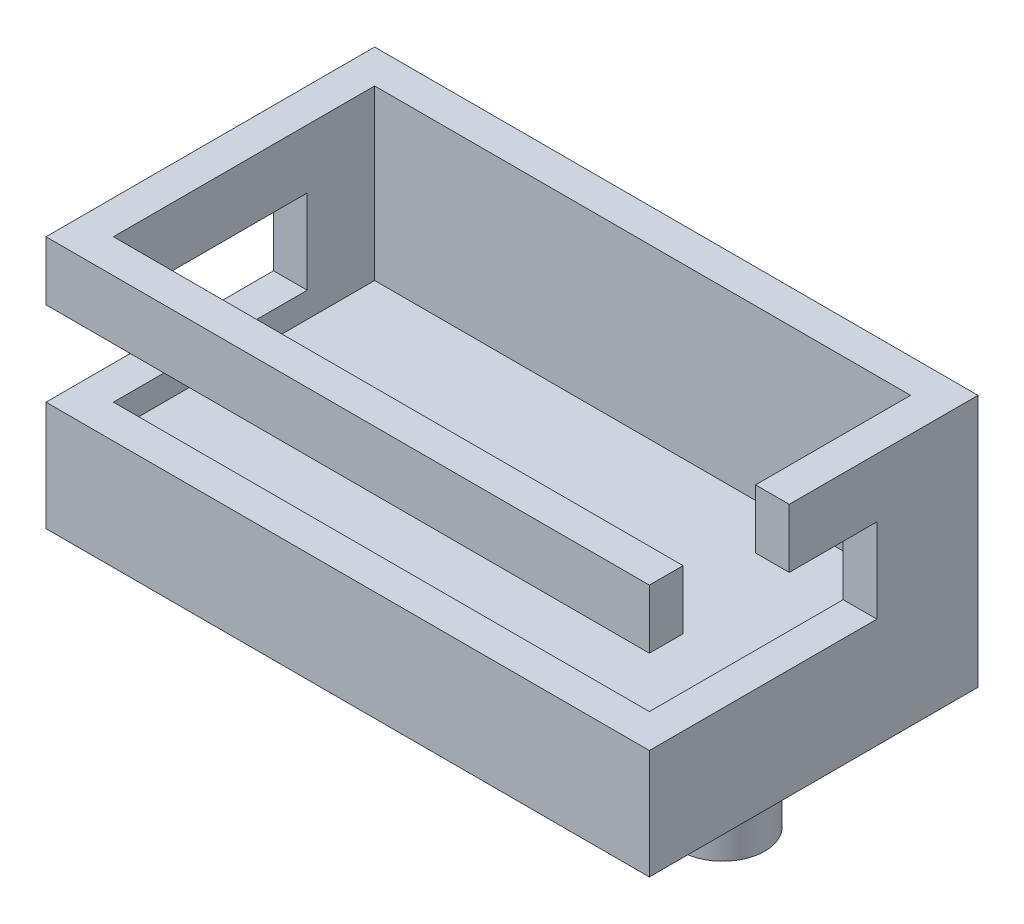
ISO-10303-21;
HEADER;
FILE_DESCRIPTION(('STEP AP214'),'2;1');
FILE_NAME('part.step','',(''),(''),'','','');
FILE_SCHEMA(('AUTOMOTIVE_DESIGN { 1 0 10303 214 1 1 1 1 }'));
ENDSEC;
DATA;
#1=APPLICATION_CONTEXT('core data for automotive mechanical design processes');
#2=APPLICATION_PROTOCOL_DEFINITION('international standard','automotive_design',2000,#1);
#3=PRODUCT_CONTEXT('',#1,'mechanical');
#4=PRODUCT('Part','Part','',(#3));
#5=PRODUCT_RELATED_PRODUCT_CATEGORY('part','',(#4));
#6=PRODUCT_DEFINITION_FORMATION('','',#4);
#7=PRODUCT_DEFINITION_CONTEXT('part definition',#1,'design');
#8=PRODUCT_DEFINITION('design','',#6,#7);
#9=PRODUCT_DEFINITION_SHAPE('','',#8);
#10=(LENGTH_UNIT() NAMED_UNIT(*) SI_UNIT(.MILLI.,.METRE.));
#11=(NAMED_UNIT(*) PLANE_ANGLE_UNIT() SI_UNIT($,.RADIAN.));
#12=(NAMED_UNIT(*) SI_UNIT($,.STERADIAN.) SOLID_ANGLE_UNIT());
#13=UNCERTAINTY_MEASURE_WITH_UNIT(LENGTH_MEASURE(1.E-05),#10,'distance_accuracy_value','');
#14=(GEOMETRIC_REPRESENTATION_CONTEXT(3) GLOBAL_UNCERTAINTY_ASSIGNED_CONTEXT((#13)) GLOBAL_UNIT_ASSIGNED_CONTEXT((#10,
#11,#12)) REPRESENTATION_CONTEXT('',''));
#15=CARTESIAN_POINT('',(0.,0.,0.));
#16=DIRECTION('',(0.,0.,1.));
#17=DIRECTION('',(1.,0.,0.));
#18=AXIS2_PLACEMENT_3D('',#15,#16,#17);
#19=CARTESIAN_POINT('',(33.8,10.,2.));
#20=DIRECTION('',(-1.,0.,0.));
#21=DIRECTION('',(0.,0.,1.));
#22=AXIS2_PLACEMENT_3D('',#19,#20,#21);
#23=PLANE('',#22);
#24=DIRECTION('',(0.,0.,-1.));
#25=VECTOR('',#24,1.);
#26=CARTESIAN_POINT('',(33.8,10.,2.));
#27=LINE('',#26,#25);
#28=CARTESIAN_POINT('',(33.8,10.,-6.30000000000001));
#29=VERTEX_POINT('',#28);
#30=CARTESIAN_POINT('',(33.8,10.,-17.5));
#31=VERTEX_POINT('',#30);
#32=EDGE_CURVE('E206',#29,#31,#27,.T.);
#33=ORIENTED_EDGE('',*,*,#32,.F.);
#34=DIRECTION('',(0.,1.,0.));
#35=VECTOR('',#34,1.);
#36=CARTESIAN_POINT('',(33.8,6.5,-6.30000000000001));
#37=LINE('',#36,#35);
#38=CARTESIAN_POINT('',(33.8,6.5,-6.30000000000001));
#39=VERTEX_POINT('',#38);
#40=EDGE_CURVE('E196',#39,#29,#37,.T.);
#41=ORIENTED_EDGE('',*,*,#40,.F.);
#42=DIRECTION('',(0.,0.,1.));
#43=VECTOR('',#42,1.);
#44=CARTESIAN_POINT('',(33.8,6.5,-53.6474757071638));
#45=LINE('',#44,#43);
#46=CARTESIAN_POINT('',(33.8,6.5,-11.5));
#47=VERTEX_POINT('',#46);
#48=EDGE_CURVE('E312',#47,#39,#45,.T.);
#49=ORIENTED_EDGE('',*,*,#48,.F.);
#50=DIRECTION('',(0.,-1.,0.));
#51=VECTOR('',#50,1.);
#52=CARTESIAN_POINT('',(33.8,6.5,-11.5));
#53=LINE('',#52,#51);
#54=CARTESIAN_POINT('',(33.8,1.5,-11.5));
#55=VERTEX_POINT('',#54);
#56=EDGE_CURVE('E288',#47,#55,#53,.T.);
#57=ORIENTED_EDGE('',*,*,#56,.T.);
#58=DIRECTION('',(0.,0.,1.));
#59=VECTOR('',#58,1.);
#60=CARTESIAN_POINT('',(33.8,1.5,-53.6474757071638));
#61=LINE('',#60,#59);
#62=CARTESIAN_POINT('',(33.8,1.5,2.));
#63=VERTEX_POINT('',#62);
#64=EDGE_CURVE('E316',#55,#63,#61,.T.);
#65=ORIENTED_EDGE('',*,*,#64,.T.);
#66=DIRECTION('',(0.,-1.,0.));
#67=VECTOR('',#66,1.);
#68=CARTESIAN_POINT('',(33.8,10.,2.));
#69=LINE('',#68,#67);
#70=CARTESIAN_POINT('',(33.8,-5.,2.));
#71=VERTEX_POINT('',#70);
#72=EDGE_CURVE('E228',#63,#71,#69,.T.);
#73=ORIENTED_EDGE('',*,*,#72,.T.);
#74=DIRECTION('',(0.,0.,-1.));
#75=VECTOR('',#74,1.);
#76=CARTESIAN_POINT('',(33.8,-5.,0.));
#77=LINE('',#76,#75);
#78=CARTESIAN_POINT('',(33.8,-5.,-17.5));
#79=VERTEX_POINT('',#78);
#80=EDGE_CURVE('E349',#71,#79,#77,.T.);
#81=ORIENTED_EDGE('',*,*,#80,.T.);
#82=DIRECTION('',(0.,-1.,0.));
#83=VECTOR('',#82,1.);
#84=CARTESIAN_POINT('',(33.8,10.,-17.5));
#85=LINE('',#84,#83);
#86=EDGE_CURVE('E225',#31,#79,#85,.T.);
#87=ORIENTED_EDGE('',*,*,#86,.F.);
#88=EDGE_LOOP('',(#33,#41,#49,#57,#65,#73,#81,#87));
#89=FACE_BOUND('',#88,.T.);
#90=ADVANCED_FACE('F49',(#89),#23,.F.);
#91=CARTESIAN_POINT('',(-2.,6.5,-53.6474757071638));
#92=DIRECTION('',(0.,1.,0.));
#93=DIRECTION('',(-1.,0.,0.));
#94=AXIS2_PLACEMENT_3D('',#91,#92,#93);
#95=PLANE('',#94);
#96=ORIENTED_EDGE('',*,*,#48,.T.);
#97=DIRECTION('',(1.,0.,0.));
#98=VECTOR('',#97,1.);
#99=CARTESIAN_POINT('',(24.5930589013091,6.5,-6.30000000000001));
#100=LINE('',#99,#98);
#101=CARTESIAN_POINT('',(31.8,6.5,-6.30000000000001));
#102=VERTEX_POINT('',#101);
#103=EDGE_CURVE('E278',#102,#39,#100,.T.);
#104=ORIENTED_EDGE('',*,*,#103,.F.);
#105=DIRECTION('',(0.,0.,-1.));
#106=VECTOR('',#105,1.);
#107=CARTESIAN_POINT('',(31.8,6.5,0.));
#108=LINE('',#107,#106);
#109=CARTESIAN_POINT('',(31.8,6.5,-11.5));
#110=VERTEX_POINT('',#109);
#111=EDGE_CURVE('E239',#102,#110,#108,.T.);
#112=ORIENTED_EDGE('',*,*,#111,.T.);
#113=DIRECTION('',(1.,0.,0.));
#114=VECTOR('',#113,1.);
#115=CARTESIAN_POINT('',(-2.,6.5,-11.5));
#116=LINE('',#115,#114);
#117=EDGE_CURVE('E292',#110,#47,#116,.T.);
#118=ORIENTED_EDGE('',*,*,#117,.T.);
#119=EDGE_LOOP('',(#96,#104,#112,#118));
#120=FACE_BOUND('',#119,.T.);
#121=ADVANCED_FACE('F420',(#120),#95,.F.);
#122=CARTESIAN_POINT('',(-2.,10.,2.));
#123=DIRECTION('',(0.,0.,-1.));
#124=DIRECTION('',(-1.,0.,0.));
#125=AXIS2_PLACEMENT_3D('',#122,#123,#124);
#126=PLANE('',#125);
#127=DIRECTION('',(0.,-1.,0.));
#128=VECTOR('',#127,1.);
#129=CARTESIAN_POINT('',(-2.,10.,2.));
#130=LINE('',#129,#128);
#131=CARTESIAN_POINT('',(-2.,10.,2.));
#132=VERTEX_POINT('',#131);
#133=CARTESIAN_POINT('',(-2.,6.5,2.));
#134=VERTEX_POINT('',#133);
#135=EDGE_CURVE('E218',#132,#134,#130,.T.);
#136=ORIENTED_EDGE('',*,*,#135,.T.);
#137=DIRECTION('',(-1.,0.,0.));
#138=VECTOR('',#137,1.);
#139=CARTESIAN_POINT('',(-2.,6.5,2.));
#140=LINE('',#139,#138);
#141=CARTESIAN_POINT('',(33.8,6.5,2.));
#142=VERTEX_POINT('',#141);
#143=EDGE_CURVE('E305',#142,#134,#140,.T.);
#144=ORIENTED_EDGE('',*,*,#143,.F.);
#145=CARTESIAN_POINT('',(33.8,10.,2.));
#146=VERTEX_POINT('',#145);
#147=EDGE_CURVE('E229',#146,#142,#69,.T.);
#148=ORIENTED_EDGE('',*,*,#147,.F.);
#149=DIRECTION('',(1.,0.,0.));
#150=VECTOR('',#149,1.);
#151=CARTESIAN_POINT('',(-2.,10.,2.));
#152=LINE('',#151,#150);
#153=EDGE_CURVE('E202',#132,#146,#152,.T.);
#154=ORIENTED_EDGE('',*,*,#153,.F.);
#155=EDGE_LOOP('',(#136,#144,#148,#154));
#156=FACE_BOUND('',#155,.T.);
#157=ADVANCED_FACE('F431',(#156),#126,.F.);
#158=CARTESIAN_POINT('',(0.,10.,0.));
#159=DIRECTION('',(0.,0.,-1.));
#160=DIRECTION('',(-1.,0.,0.));
#161=AXIS2_PLACEMENT_3D('',#158,#159,#160);
#162=PLANE('',#161);
#163=DIRECTION('',(1.,0.,0.));
#164=VECTOR('',#163,1.);
#165=CARTESIAN_POINT('',(0.,6.5,0.));
#166=LINE('',#165,#164);
#167=CARTESIAN_POINT('',(0.,6.5,0.));
#168=VERTEX_POINT('',#167);
#169=CARTESIAN_POINT('',(33.8,6.5,0.));
#170=VERTEX_POINT('',#169);
#171=EDGE_CURVE('E65',#168,#170,#166,.T.);
#172=ORIENTED_EDGE('',*,*,#171,.F.);
#173=DIRECTION('',(0.,-1.,0.));
#174=VECTOR('',#173,1.);
#175=CARTESIAN_POINT('',(0.,10.,0.));
#176=LINE('',#175,#174);
#177=CARTESIAN_POINT('',(0.,10.,0.));
#178=VERTEX_POINT('',#177);
#179=EDGE_CURVE('E181',#178,#168,#176,.T.);
#180=ORIENTED_EDGE('',*,*,#179,.F.);
#181=DIRECTION('',(1.,0.,0.));
#182=VECTOR('',#181,1.);
#183=CARTESIAN_POINT('',(0.,10.,0.));
#184=LINE('',#183,#182);
#185=CARTESIAN_POINT('',(33.8,10.,0.));
#186=VERTEX_POINT('',#185);
#187=EDGE_CURVE('E175',#178,#186,#184,.T.);
#188=ORIENTED_EDGE('',*,*,#187,.T.);
#189=DIRECTION('',(0.,-1.,0.));
#190=VECTOR('',#189,1.);
#191=CARTESIAN_POINT('',(33.8,6.5,0.));
#192=LINE('',#191,#190);
#193=EDGE_CURVE('E178',#186,#170,#192,.T.);
#194=ORIENTED_EDGE('',*,*,#193,.T.);
#195=EDGE_LOOP('',(#172,#180,#188,#194));
#196=FACE_BOUND('',#195,.T.);
#197=ADVANCED_FACE('F177',(#196),#162,.T.);
#198=CARTESIAN_POINT('',(0.,10.,0.));
#199=DIRECTION('',(0.,1.,0.));
#200=DIRECTION('',(0.,0.,1.));
#201=AXIS2_PLACEMENT_3D('',#198,#199,#200);
#202=PLANE('',#201);
#203=DIRECTION('',(1.,0.,0.));
#204=VECTOR('',#203,1.);
#205=CARTESIAN_POINT('',(24.5930589013091,10.,-6.30000000000001));
#206=LINE('',#205,#204);
#207=CARTESIAN_POINT('',(31.8,10.,-6.30000000000001));
#208=VERTEX_POINT('',#207);
#209=EDGE_CURVE('E282',#208,#29,#206,.T.);
#210=ORIENTED_EDGE('',*,*,#209,.T.);
#211=ORIENTED_EDGE('',*,*,#32,.T.);
#212=DIRECTION('',(-1.,0.,0.));
#213=VECTOR('',#212,1.);
#214=CARTESIAN_POINT('',(-2.,10.,-17.5));
#215=LINE('',#214,#213);
#216=CARTESIAN_POINT('',(-2.,10.,-17.5));
#217=VERTEX_POINT('',#216);
#218=EDGE_CURVE('E205',#31,#217,#215,.T.);
#219=ORIENTED_EDGE('',*,*,#218,.T.);
#220=DIRECTION('',(0.,0.,1.));
#221=VECTOR('',#220,1.);
#222=CARTESIAN_POINT('',(-2.,10.,2.));
#223=LINE('',#222,#221);
#224=EDGE_CURVE('E210',#217,#132,#223,.T.);
#225=ORIENTED_EDGE('',*,*,#224,.T.);
#226=ORIENTED_EDGE('',*,*,#153,.T.);
#227=EDGE_CURVE('E192',#146,#186,#27,.T.);
#228=ORIENTED_EDGE('',*,*,#227,.T.);
#229=ORIENTED_EDGE('',*,*,#187,.F.);
#230=DIRECTION('',(0.,0.,1.));
#231=VECTOR('',#230,1.);
#232=CARTESIAN_POINT('',(0.,10.,0.));
#233=LINE('',#232,#231);
#234=CARTESIAN_POINT('',(0.,10.,-15.5));
#235=VERTEX_POINT('',#234);
#236=EDGE_CURVE('E187',#235,#178,#233,.T.);
#237=ORIENTED_EDGE('',*,*,#236,.F.);
#238=DIRECTION('',(-1.,0.,0.));
#239=VECTOR('',#238,1.);
#240=CARTESIAN_POINT('',(0.,10.,-15.5));
#241=LINE('',#240,#239);
#242=CARTESIAN_POINT('',(31.8,10.,-15.5));
#243=VERTEX_POINT('',#242);
#244=EDGE_CURVE('E363',#243,#235,#241,.T.);
#245=ORIENTED_EDGE('',*,*,#244,.F.);
#246=DIRECTION('',(0.,0.,-1.));
#247=VECTOR('',#246,1.);
#248=CARTESIAN_POINT('',(31.8,10.,0.));
#249=LINE('',#248,#247);
#250=EDGE_CURVE('E186',#208,#243,#249,.T.);
#251=ORIENTED_EDGE('',*,*,#250,.F.);
#252=EDGE_LOOP('',(#210,#211,#219,#225,#226,#228,#229,#237,#245,#251));
#253=FACE_BOUND('',#252,.T.);
#254=ADVANCED_FACE('F200',(#253),#202,.T.);
#255=ORIENTED_EDGE('',*,*,#72,.F.);
#256=DIRECTION('',(1.,0.,0.));
#257=VECTOR('',#256,1.);
#258=CARTESIAN_POINT('',(-2.,1.5,2.));
#259=LINE('',#258,#257);
#260=CARTESIAN_POINT('',(-2.,1.5,2.));
#261=VERTEX_POINT('',#260);
#262=EDGE_CURVE('E285',#261,#63,#259,.T.);
#263=ORIENTED_EDGE('',*,*,#262,.F.);
#264=CARTESIAN_POINT('',(-2.,-5.,2.));
#265=VERTEX_POINT('',#264);
#266=EDGE_CURVE('E217',#261,#265,#130,.T.);
#267=ORIENTED_EDGE('',*,*,#266,.T.);
#268=DIRECTION('',(1.,0.,0.));
#269=VECTOR('',#268,1.);
#270=CARTESIAN_POINT('',(0.,-5.,2.));
#271=LINE('',#270,#269);
#272=EDGE_CURVE('E345',#265,#71,#271,.T.);
#273=ORIENTED_EDGE('',*,*,#272,.T.);
#274=EDGE_LOOP('',(#255,#263,#267,#273));
#275=FACE_BOUND('',#274,.T.);
#276=ADVANCED_FACE('F473',(#275),#126,.F.);
#277=EDGE_CURVE('E194',#170,#142,#45,.T.);
#278=ORIENTED_EDGE('',*,*,#277,.F.);
#279=ORIENTED_EDGE('',*,*,#193,.F.);
#280=ORIENTED_EDGE('',*,*,#227,.F.);
#281=ORIENTED_EDGE('',*,*,#147,.T.);
#282=EDGE_LOOP('',(#278,#279,#280,#281));
#283=FACE_BOUND('',#282,.T.);
#284=ADVANCED_FACE('F190',(#283),#23,.F.);
#285=CARTESIAN_POINT('',(-2.,10.,-17.5));
#286=DIRECTION('',(0.,0.,1.));
#287=DIRECTION('',(1.,0.,0.));
#288=AXIS2_PLACEMENT_3D('',#285,#286,#287);
#289=PLANE('',#288);
#290=ORIENTED_EDGE('',*,*,#86,.T.);
#291=DIRECTION('',(1.,0.,0.));
#292=VECTOR('',#291,1.);
#293=CARTESIAN_POINT('',(0.,-5.,-17.5));
#294=LINE('',#293,#292);
#295=CARTESIAN_POINT('',(-2.,-5.,-17.5));
#296=VERTEX_POINT('',#295);
#297=EDGE_CURVE('E353',#296,#79,#294,.T.);
#298=ORIENTED_EDGE('',*,*,#297,.F.);
#299=DIRECTION('',(0.,-1.,0.));
#300=VECTOR('',#299,1.);
#301=CARTESIAN_POINT('',(-2.,10.,-17.5));
#302=LINE('',#301,#300);
#303=EDGE_CURVE('E222',#217,#296,#302,.T.);
#304=ORIENTED_EDGE('',*,*,#303,.F.);
#305=ORIENTED_EDGE('',*,*,#218,.F.);
#306=EDGE_LOOP('',(#290,#298,#304,#305));
#307=FACE_BOUND('',#306,.T.);
#308=ADVANCED_FACE('F472',(#307),#289,.F.);
#309=CARTESIAN_POINT('',(-2.,10.,2.));
#310=DIRECTION('',(1.,0.,0.));
#311=DIRECTION('',(0.,0.,-1.));
#312=AXIS2_PLACEMENT_3D('',#309,#310,#311);
#313=PLANE('',#312);
#314=DIRECTION('',(0.,1.,0.));
#315=VECTOR('',#314,1.);
#316=CARTESIAN_POINT('',(-2.,6.5,-11.5));
#317=LINE('',#316,#315);
#318=CARTESIAN_POINT('',(-2.,1.5,-11.5));
#319=VERTEX_POINT('',#318);
#320=CARTESIAN_POINT('',(-2.,6.5,-11.5));
#321=VERTEX_POINT('',#320);
#322=EDGE_CURVE('E298',#319,#321,#317,.T.);
#323=ORIENTED_EDGE('',*,*,#322,.T.);
#324=DIRECTION('',(0.,0.,1.));
#325=VECTOR('',#324,1.);
#326=CARTESIAN_POINT('',(-2.,6.5,-53.6474757071638));
#327=LINE('',#326,#325);
#328=EDGE_CURVE('E293',#321,#134,#327,.T.);
#329=ORIENTED_EDGE('',*,*,#328,.T.);
#330=ORIENTED_EDGE('',*,*,#135,.F.);
#331=ORIENTED_EDGE('',*,*,#224,.F.);
#332=ORIENTED_EDGE('',*,*,#303,.T.);
#333=DIRECTION('',(0.,0.,-1.));
#334=VECTOR('',#333,1.);
#335=CARTESIAN_POINT('',(-2.,-5.,0.));
#336=LINE('',#335,#334);
#337=EDGE_CURVE('E341',#265,#296,#336,.T.);
#338=ORIENTED_EDGE('',*,*,#337,.F.);
#339=ORIENTED_EDGE('',*,*,#266,.F.);
#340=DIRECTION('',(0.,0.,1.));
#341=VECTOR('',#340,1.);
#342=CARTESIAN_POINT('',(-2.,1.5,-53.6474757071638));
#343=LINE('',#342,#341);
#344=EDGE_CURVE('E308',#319,#261,#343,.T.);
#345=ORIENTED_EDGE('',*,*,#344,.F.);
#346=EDGE_LOOP('',(#323,#329,#330,#331,#332,#338,#339,#345));
#347=FACE_BOUND('',#346,.T.);
#348=ADVANCED_FACE('F435',(#347),#313,.F.);
#349=CARTESIAN_POINT('',(0.,10.,0.));
#350=DIRECTION('',(1.,0.,0.));
#351=DIRECTION('',(0.,0.,-1.));
#352=AXIS2_PLACEMENT_3D('',#349,#350,#351);
#353=PLANE('',#352);
#354=DIRECTION('',(0.,0.,1.));
#355=VECTOR('',#354,1.);
#356=CARTESIAN_POINT('',(0.,6.5,0.));
#357=LINE('',#356,#355);
#358=CARTESIAN_POINT('',(0.,6.5,-11.5));
#359=VERTEX_POINT('',#358);
#360=EDGE_CURVE('E338',#359,#168,#357,.T.);
#361=ORIENTED_EDGE('',*,*,#360,.F.);
#362=DIRECTION('',(0.,-1.,0.));
#363=VECTOR('',#362,1.);
#364=CARTESIAN_POINT('',(0.,10.,-11.5));
#365=LINE('',#364,#363);
#366=CARTESIAN_POINT('',(0.,1.5,-11.5));
#367=VERTEX_POINT('',#366);
#368=EDGE_CURVE('E326',#359,#367,#365,.T.);
#369=ORIENTED_EDGE('',*,*,#368,.T.);
#370=DIRECTION('',(0.,0.,-1.));
#371=VECTOR('',#370,1.);
#372=CARTESIAN_POINT('',(0.,1.5,0.));
#373=LINE('',#372,#371);
#374=CARTESIAN_POINT('',(0.,1.5,0.));
#375=VERTEX_POINT('',#374);
#376=EDGE_CURVE('E333',#375,#367,#373,.T.);
#377=ORIENTED_EDGE('',*,*,#376,.F.);
#378=CARTESIAN_POINT('',(0.,0.,0.));
#379=VERTEX_POINT('',#378);
#380=EDGE_CURVE('E388',#375,#379,#176,.T.);
#381=ORIENTED_EDGE('',*,*,#380,.T.);
#382=DIRECTION('',(0.,0.,1.));
#383=VECTOR('',#382,1.);
#384=CARTESIAN_POINT('',(0.,0.,0.));
#385=LINE('',#384,#383);
#386=CARTESIAN_POINT('',(0.,0.,-15.5));
#387=VERTEX_POINT('',#386);
#388=EDGE_CURVE('E357',#387,#379,#385,.T.);
#389=ORIENTED_EDGE('',*,*,#388,.F.);
#390=DIRECTION('',(0.,-1.,0.));
#391=VECTOR('',#390,1.);
#392=CARTESIAN_POINT('',(0.,10.,-15.5));
#393=LINE('',#392,#391);
#394=EDGE_CURVE('E366',#235,#387,#393,.T.);
#395=ORIENTED_EDGE('',*,*,#394,.F.);
#396=ORIENTED_EDGE('',*,*,#236,.T.);
#397=ORIENTED_EDGE('',*,*,#179,.T.);
#398=EDGE_LOOP('',(#361,#369,#377,#381,#389,#395,#396,#397));
#399=FACE_BOUND('',#398,.T.);
#400=ADVANCED_FACE('F398',(#399),#353,.T.);
#401=DIRECTION('',(-1.,0.,0.));
#402=VECTOR('',#401,1.);
#403=CARTESIAN_POINT('',(0.,1.5,0.));
#404=LINE('',#403,#402);
#405=CARTESIAN_POINT('',(31.8,1.5,0.));
#406=VERTEX_POINT('',#405);
#407=EDGE_CURVE('E330',#406,#375,#404,.T.);
#408=ORIENTED_EDGE('',*,*,#407,.F.);
#409=DIRECTION('',(0.,-1.,0.));
#410=VECTOR('',#409,1.);
#411=CARTESIAN_POINT('',(31.8,10.,0.));
#412=LINE('',#411,#410);
#413=CARTESIAN_POINT('',(31.8,0.,0.));
#414=VERTEX_POINT('',#413);
#415=EDGE_CURVE('E386',#406,#414,#412,.T.);
#416=ORIENTED_EDGE('',*,*,#415,.T.);
#417=DIRECTION('',(1.,0.,0.));
#418=VECTOR('',#417,1.);
#419=CARTESIAN_POINT('',(0.,0.,0.));
#420=LINE('',#419,#418);
#421=EDGE_CURVE('E370',#379,#414,#420,.T.);
#422=ORIENTED_EDGE('',*,*,#421,.F.);
#423=ORIENTED_EDGE('',*,*,#380,.F.);
#424=EDGE_LOOP('',(#408,#416,#422,#423));
#425=FACE_BOUND('',#424,.T.);
#426=ADVANCED_FACE('F402',(#425),#162,.T.);
#427=CARTESIAN_POINT('',(31.8,10.,0.));
#428=DIRECTION('',(-1.,0.,0.));
#429=DIRECTION('',(0.,0.,1.));
#430=AXIS2_PLACEMENT_3D('',#427,#428,#429);
#431=PLANE('',#430);
#432=DIRECTION('',(0.,1.,0.));
#433=VECTOR('',#432,1.);
#434=CARTESIAN_POINT('',(31.8,6.5,-6.30000000000001));
#435=LINE('',#434,#433);
#436=EDGE_CURVE('E73',#102,#208,#435,.T.);
#437=ORIENTED_EDGE('',*,*,#436,.T.);
#438=ORIENTED_EDGE('',*,*,#250,.T.);
#439=DIRECTION('',(0.,-1.,0.));
#440=VECTOR('',#439,1.);
#441=CARTESIAN_POINT('',(31.8,10.,-15.5));
#442=LINE('',#441,#440);
#443=CARTESIAN_POINT('',(31.8,0.,-15.5));
#444=VERTEX_POINT('',#443);
#445=EDGE_CURVE('E383',#243,#444,#442,.T.);
#446=ORIENTED_EDGE('',*,*,#445,.T.);
#447=DIRECTION('',(0.,0.,-1.));
#448=VECTOR('',#447,1.);
#449=CARTESIAN_POINT('',(31.8,0.,0.));
#450=LINE('',#449,#448);
#451=EDGE_CURVE('E374',#414,#444,#450,.T.);
#452=ORIENTED_EDGE('',*,*,#451,.F.);
#453=ORIENTED_EDGE('',*,*,#415,.F.);
#454=DIRECTION('',(0.,0.,1.));
#455=VECTOR('',#454,1.);
#456=CARTESIAN_POINT('',(31.8,1.5,0.));
#457=LINE('',#456,#455);
#458=CARTESIAN_POINT('',(31.8,1.5,-11.5));
#459=VERTEX_POINT('',#458);
#460=EDGE_CURVE('E236',#459,#406,#457,.T.);
#461=ORIENTED_EDGE('',*,*,#460,.F.);
#462=DIRECTION('',(0.,1.,0.));
#463=VECTOR('',#462,1.);
#464=CARTESIAN_POINT('',(31.8,10.,-11.5));
#465=LINE('',#464,#463);
#466=EDGE_CURVE('E232',#459,#110,#465,.T.);
#467=ORIENTED_EDGE('',*,*,#466,.T.);
#468=ORIENTED_EDGE('',*,*,#111,.F.);
#469=EDGE_LOOP('',(#437,#438,#446,#452,#453,#461,#467,#468));
#470=FACE_BOUND('',#469,.T.);
#471=ADVANCED_FACE('F415',(#470),#431,.T.);
#472=CARTESIAN_POINT('',(0.,10.,-15.5));
#473=DIRECTION('',(0.,0.,1.));
#474=DIRECTION('',(1.,0.,0.));
#475=AXIS2_PLACEMENT_3D('',#472,#473,#474);
#476=PLANE('',#475);
#477=DIRECTION('',(-1.,0.,0.));
#478=VECTOR('',#477,1.);
#479=CARTESIAN_POINT('',(0.,0.,-15.5));
#480=LINE('',#479,#478);
#481=EDGE_CURVE('E359',#444,#387,#480,.T.);
#482=ORIENTED_EDGE('',*,*,#481,.F.);
#483=ORIENTED_EDGE('',*,*,#445,.F.);
#484=ORIENTED_EDGE('',*,*,#244,.T.);
#485=ORIENTED_EDGE('',*,*,#394,.T.);
#486=EDGE_LOOP('',(#482,#483,#484,#485));
#487=FACE_BOUND('',#486,.T.);
#488=ADVANCED_FACE('F410',(#487),#476,.T.);
#489=CARTESIAN_POINT('',(0.,0.,0.));
#490=DIRECTION('',(0.,1.,0.));
#491=DIRECTION('',(0.,0.,1.));
#492=AXIS2_PLACEMENT_3D('',#489,#490,#491);
#493=PLANE('',#492);
#494=ORIENTED_EDGE('',*,*,#481,.T.);
#495=ORIENTED_EDGE('',*,*,#388,.T.);
#496=ORIENTED_EDGE('',*,*,#421,.T.);
#497=ORIENTED_EDGE('',*,*,#451,.T.);
#498=EDGE_LOOP('',(#494,#495,#496,#497));
#499=FACE_BOUND('',#498,.T.);
#500=ADVANCED_FACE('F406',(#499),#493,.T.);
#501=CARTESIAN_POINT('',(0.,-5.,0.));
#502=DIRECTION('',(0.,1.,0.));
#503=DIRECTION('',(0.,0.,1.));
#504=AXIS2_PLACEMENT_3D('',#501,#502,#503);
#505=PLANE('',#504);
#506=CARTESIAN_POINT('',(28.4,-5.,-7.75));
#507=DIRECTION('',(0.,1.,0.));
#508=DIRECTION('',(0.,0.,1.));
#509=AXIS2_PLACEMENT_3D('',#506,#507,#508);
#510=CIRCLE('',#509,2.9);
#511=CARTESIAN_POINT('',(28.4,-5.,-4.85));
#512=VERTEX_POINT('',#511);
#513=EDGE_CURVE('E58',#512,#512,#510,.T.);
#514=ORIENTED_EDGE('',*,*,#513,.T.);
#515=EDGE_LOOP('',(#514));
#516=FACE_BOUND('',#515,.T.);
#517=CARTESIAN_POINT('',(3.4,-5.,-7.75));
#518=DIRECTION('',(0.,1.,0.));
#519=DIRECTION('',(0.,0.,1.));
#520=AXIS2_PLACEMENT_3D('',#517,#518,#519);
#521=CIRCLE('',#520,2.9);
#522=CARTESIAN_POINT('',(3.4,-5.,-4.85));
#523=VERTEX_POINT('',#522);
#524=EDGE_CURVE('E246',#523,#523,#521,.T.);
#525=ORIENTED_EDGE('',*,*,#524,.T.);
#526=EDGE_LOOP('',(#525));
#527=FACE_BOUND('',#526,.T.);
#528=ORIENTED_EDGE('',*,*,#337,.T.);
#529=ORIENTED_EDGE('',*,*,#297,.T.);
#530=ORIENTED_EDGE('',*,*,#80,.F.);
#531=ORIENTED_EDGE('',*,*,#272,.F.);
#532=EDGE_LOOP('',(#528,#529,#530,#531));
#533=FACE_BOUND('',#532,.T.);
#534=ADVANCED_FACE('F253',(#516,#527,#533),#505,.F.);
#535=CARTESIAN_POINT('',(-2.,10.,-11.5));
#536=DIRECTION('',(0.,0.,1.));
#537=DIRECTION('',(1.,0.,0.));
#538=AXIS2_PLACEMENT_3D('',#535,#536,#537);
#539=PLANE('',#538);
#540=EDGE_CURVE('E294',#321,#359,#116,.T.);
#541=ORIENTED_EDGE('',*,*,#540,.F.);
#542=ORIENTED_EDGE('',*,*,#322,.F.);
#543=DIRECTION('',(-1.,0.,0.));
#544=VECTOR('',#543,1.);
#545=CARTESIAN_POINT('',(-2.,1.5,-11.5));
#546=LINE('',#545,#544);
#547=EDGE_CURVE('E302',#367,#319,#546,.T.);
#548=ORIENTED_EDGE('',*,*,#547,.F.);
#549=ORIENTED_EDGE('',*,*,#368,.F.);
#550=EDGE_LOOP('',(#541,#542,#548,#549));
#551=FACE_BOUND('',#550,.T.);
#552=ADVANCED_FACE('F440',(#551),#539,.T.);
#553=ORIENTED_EDGE('',*,*,#171,.T.);
#554=ORIENTED_EDGE('',*,*,#277,.T.);
#555=ORIENTED_EDGE('',*,*,#143,.T.);
#556=ORIENTED_EDGE('',*,*,#328,.F.);
#557=ORIENTED_EDGE('',*,*,#540,.T.);
#558=ORIENTED_EDGE('',*,*,#360,.T.);
#559=EDGE_LOOP('',(#553,#554,#555,#556,#557,#558));
#560=FACE_BOUND('',#559,.T.);
#561=ADVANCED_FACE('F429',(#560),#95,.F.);
#562=CARTESIAN_POINT('',(-2.,1.5,-53.6474757071638));
#563=DIRECTION('',(0.,-1.,0.));
#564=DIRECTION('',(0.,0.,-1.));
#565=AXIS2_PLACEMENT_3D('',#562,#563,#564);
#566=PLANE('',#565);
#567=ORIENTED_EDGE('',*,*,#376,.T.);
#568=ORIENTED_EDGE('',*,*,#547,.T.);
#569=ORIENTED_EDGE('',*,*,#344,.T.);
#570=ORIENTED_EDGE('',*,*,#262,.T.);
#571=ORIENTED_EDGE('',*,*,#64,.F.);
#572=EDGE_CURVE('E322',#55,#459,#546,.T.);
#573=ORIENTED_EDGE('',*,*,#572,.T.);
#574=ORIENTED_EDGE('',*,*,#460,.T.);
#575=ORIENTED_EDGE('',*,*,#407,.T.);
#576=EDGE_LOOP('',(#567,#568,#569,#570,#571,#573,#574,#575));
#577=FACE_BOUND('',#576,.T.);
#578=ADVANCED_FACE('F444',(#577),#566,.F.);
#579=ORIENTED_EDGE('',*,*,#572,.F.);
#580=ORIENTED_EDGE('',*,*,#56,.F.);
#581=ORIENTED_EDGE('',*,*,#117,.F.);
#582=ORIENTED_EDGE('',*,*,#466,.F.);
#583=EDGE_LOOP('',(#579,#580,#581,#582));
#584=FACE_BOUND('',#583,.T.);
#585=ADVANCED_FACE('F424',(#584),#539,.T.);
#586=CARTESIAN_POINT('',(24.5930589013091,6.5,-6.30000000000001));
#587=DIRECTION('',(0.,0.,-1.));
#588=DIRECTION('',(-1.,0.,0.));
#589=AXIS2_PLACEMENT_3D('',#586,#587,#588);
#590=PLANE('',#589);
#591=ORIENTED_EDGE('',*,*,#103,.T.);
#592=ORIENTED_EDGE('',*,*,#40,.T.);
#593=ORIENTED_EDGE('',*,*,#209,.F.);
#594=ORIENTED_EDGE('',*,*,#436,.F.);
#595=EDGE_LOOP('',(#591,#592,#593,#594));
#596=FACE_BOUND('',#595,.T.);
#597=ADVANCED_FACE('F450',(#596),#590,.F.);
#598=CARTESIAN_POINT('',(3.4,-10.,-7.75));
#599=DIRECTION('',(0.,1.,0.));
#600=DIRECTION('',(0.,0.,1.));
#601=AXIS2_PLACEMENT_3D('',#598,#599,#600);
#602=CYLINDRICAL_SURFACE('',#601,2.5);
#603=CARTESIAN_POINT('',(3.4,-5.4,-7.75));
#604=DIRECTION('',(0.,1.,0.));
#605=DIRECTION('',(0.,0.,1.));
#606=AXIS2_PLACEMENT_3D('',#603,#604,#605);
#607=CIRCLE('',#606,2.5);
#608=CARTESIAN_POINT('',(3.4,-5.4,-5.25));
#609=VERTEX_POINT('',#608);
#610=EDGE_CURVE('E12',#609,#609,#607,.F.);
#611=ORIENTED_EDGE('',*,*,#610,.T.);
#612=EDGE_LOOP('',(#611));
#613=FACE_BOUND('',#612,.T.);
#614=CARTESIAN_POINT('',(3.4,-10.,-7.75));
#615=DIRECTION('',(0.,-1.,0.));
#616=DIRECTION('',(0.,0.,-1.));
#617=AXIS2_PLACEMENT_3D('',#614,#615,#616);
#618=CIRCLE('',#617,2.5);
#619=CARTESIAN_POINT('',(3.4,-10.,-10.25));
#620=VERTEX_POINT('',#619);
#621=EDGE_CURVE('E197',#620,#620,#618,.T.);
#622=ORIENTED_EDGE('',*,*,#621,.F.);
#623=EDGE_LOOP('',(#622));
#624=FACE_BOUND('',#623,.T.);
#625=ADVANCED_FACE('F452',(#613,#624),#602,.T.);
#626=CARTESIAN_POINT('',(3.4,-10.,-7.75));
#627=DIRECTION('',(0.,-1.,0.));
#628=DIRECTION('',(0.,0.,-1.));
#629=AXIS2_PLACEMENT_3D('',#626,#627,#628);
#630=PLANE('',#629);
#631=ORIENTED_EDGE('',*,*,#621,.T.);
#632=EDGE_LOOP('',(#631));
#633=FACE_BOUND('',#632,.T.);
#634=ADVANCED_FACE('F265',(#633),#630,.T.);
#635=CARTESIAN_POINT('',(28.4,-10.,-7.75));
#636=DIRECTION('',(0.,1.,0.));
#637=DIRECTION('',(0.,0.,1.));
#638=AXIS2_PLACEMENT_3D('',#635,#636,#637);
#639=CYLINDRICAL_SURFACE('',#638,2.5);
#640=CARTESIAN_POINT('',(28.4,-5.4,-7.75));
#641=DIRECTION('',(0.,1.,0.));
#642=DIRECTION('',(0.,0.,1.));
#643=AXIS2_PLACEMENT_3D('',#640,#641,#642);
#644=CIRCLE('',#643,2.5);
#645=CARTESIAN_POINT('',(28.4,-5.4,-5.25));
#646=VERTEX_POINT('',#645);
#647=EDGE_CURVE('E242',#646,#646,#644,.F.);
#648=ORIENTED_EDGE('',*,*,#647,.T.);
#649=EDGE_LOOP('',(#648));
#650=FACE_BOUND('',#649,.T.);
#651=CARTESIAN_POINT('',(28.4,-10.,-7.75));
#652=DIRECTION('',(0.,-1.,0.));
#653=DIRECTION('',(0.,0.,1.));
#654=AXIS2_PLACEMENT_3D('',#651,#652,#653);
#655=CIRCLE('',#654,2.5);
#656=CARTESIAN_POINT('',(28.4,-10.,-5.25));
#657=VERTEX_POINT('',#656);
#658=EDGE_CURVE('E269',#657,#657,#655,.T.);
#659=ORIENTED_EDGE('',*,*,#658,.F.);
#660=EDGE_LOOP('',(#659));
#661=FACE_BOUND('',#660,.T.);
#662=ADVANCED_FACE('F262',(#650,#661),#639,.T.);
#663=CARTESIAN_POINT('',(28.4,-10.,-7.75));
#664=DIRECTION('',(0.,1.,0.));
#665=DIRECTION('',(0.,0.,1.));
#666=AXIS2_PLACEMENT_3D('',#663,#664,#665);
#667=PLANE('',#666);
#668=ORIENTED_EDGE('',*,*,#658,.T.);
#669=EDGE_LOOP('',(#668));
#670=FACE_BOUND('',#669,.T.);
#671=ADVANCED_FACE('F259',(#670),#667,.F.);
#672=CARTESIAN_POINT('',(28.4,-5.4,-7.75));
#673=DIRECTION('',(0.,1.,0.));
#674=DIRECTION('',(0.,0.,1.));
#675=AXIS2_PLACEMENT_3D('',#672,#673,#674);
#676=TOROIDAL_SURFACE('',#675,2.9,0.4);
#677=ORIENTED_EDGE('',*,*,#513,.F.);
#678=EDGE_LOOP('',(#677));
#679=FACE_BOUND('',#678,.T.);
#680=ORIENTED_EDGE('',*,*,#647,.F.);
#681=EDGE_LOOP('',(#680));
#682=FACE_BOUND('',#681,.T.);
#683=ADVANCED_FACE('F256',(#679,#682),#676,.F.);
#684=CARTESIAN_POINT('',(3.4,-5.4,-7.75));
#685=DIRECTION('',(0.,1.,0.));
#686=DIRECTION('',(0.,0.,1.));
#687=AXIS2_PLACEMENT_3D('',#684,#685,#686);
#688=TOROIDAL_SURFACE('',#687,2.9,0.4);
#689=ORIENTED_EDGE('',*,*,#524,.F.);
#690=EDGE_LOOP('',(#689));
#691=FACE_BOUND('',#690,.T.);
#692=ORIENTED_EDGE('',*,*,#610,.F.);
#693=EDGE_LOOP('',(#692));
#694=FACE_BOUND('',#693,.T.);
#695=ADVANCED_FACE('F51',(#691,#694),#688,.F.);
#696=CLOSED_SHELL('',(#90,#121,#157,#197,#254,#276,#284,#308,#348,#400,#426,#471,#488,#500,#534,
#552,#561,#578,#585,#597,#625,#634,#662,#671,#683,#695));
#697=MANIFOLD_SOLID_BREP('B2',#696);
#698=ADVANCED_BREP_SHAPE_REPRESENTATION('',(#18,#697),#14);
#699=SHAPE_DEFINITION_REPRESENTATION(#9,#698);
ENDSEC;
END-ISO-10303-21;
